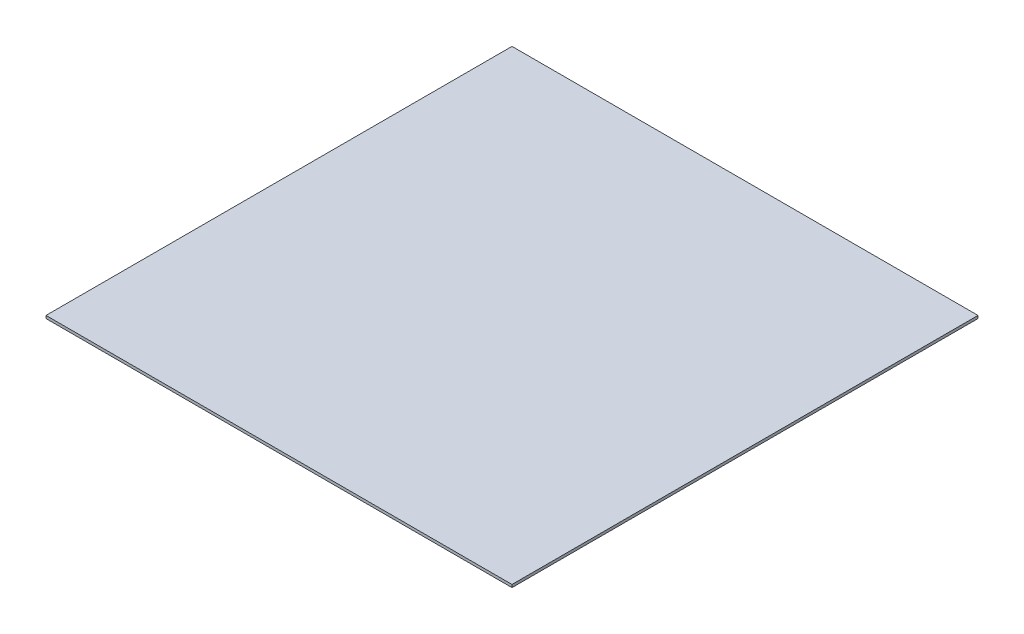
ISO-10303-21;
HEADER;
FILE_DESCRIPTION(('STEP AP214'),'2;1');
FILE_NAME('part.step','',(''),(''),'','','');
FILE_SCHEMA(('AUTOMOTIVE_DESIGN { 1 0 10303 214 1 1 1 1 }'));
ENDSEC;
DATA;
#1=APPLICATION_CONTEXT('core data for automotive mechanical design processes');
#2=APPLICATION_PROTOCOL_DEFINITION('international standard','automotive_design',2000,#1);
#3=PRODUCT_CONTEXT('',#1,'mechanical');
#4=PRODUCT('Part','Part','',(#3));
#5=PRODUCT_RELATED_PRODUCT_CATEGORY('part','',(#4));
#6=PRODUCT_DEFINITION_FORMATION('','',#4);
#7=PRODUCT_DEFINITION_CONTEXT('part definition',#1,'design');
#8=PRODUCT_DEFINITION('design','',#6,#7);
#9=PRODUCT_DEFINITION_SHAPE('','',#8);
#10=(LENGTH_UNIT() NAMED_UNIT(*) SI_UNIT(.MILLI.,.METRE.));
#11=(NAMED_UNIT(*) PLANE_ANGLE_UNIT() SI_UNIT($,.RADIAN.));
#12=(NAMED_UNIT(*) SI_UNIT($,.STERADIAN.) SOLID_ANGLE_UNIT());
#13=UNCERTAINTY_MEASURE_WITH_UNIT(LENGTH_MEASURE(1.E-05),#10,'distance_accuracy_value','');
#14=(GEOMETRIC_REPRESENTATION_CONTEXT(3) GLOBAL_UNCERTAINTY_ASSIGNED_CONTEXT((#13)) GLOBAL_UNIT_ASSIGNED_CONTEXT((#10,
#11,#12)) REPRESENTATION_CONTEXT('',''));
#15=CARTESIAN_POINT('',(0.,0.,0.));
#16=DIRECTION('',(0.,0.,1.));
#17=DIRECTION('',(1.,0.,0.));
#18=AXIS2_PLACEMENT_3D('',#15,#16,#17);
#19=CARTESIAN_POINT('',(0.,1.5,0.));
#20=DIRECTION('',(1.,0.,0.));
#21=DIRECTION('',(0.,0.,-1.));
#22=AXIS2_PLACEMENT_3D('',#19,#20,#21);
#23=PLANE('',#22);
#24=DIRECTION('',(0.,0.,1.));
#25=VECTOR('',#24,1.);
#26=CARTESIAN_POINT('',(0.,0.,0.));
#27=LINE('',#26,#25);
#28=CARTESIAN_POINT('',(0.,0.,-254.));
#29=VERTEX_POINT('',#28);
#30=CARTESIAN_POINT('',(0.,0.,0.));
#31=VERTEX_POINT('',#30);
#32=EDGE_CURVE('E107',#29,#31,#27,.T.);
#33=ORIENTED_EDGE('',*,*,#32,.T.);
#34=DIRECTION('',(0.,-1.,0.));
#35=VECTOR('',#34,1.);
#36=CARTESIAN_POINT('',(0.,1.5,0.));
#37=LINE('',#36,#35);
#38=CARTESIAN_POINT('',(0.,1.5,0.));
#39=VERTEX_POINT('',#38);
#40=EDGE_CURVE('E11',#39,#31,#37,.T.);
#41=ORIENTED_EDGE('',*,*,#40,.F.);
#42=DIRECTION('',(0.,0.,1.));
#43=VECTOR('',#42,1.);
#44=CARTESIAN_POINT('',(0.,1.5,0.));
#45=LINE('',#44,#43);
#46=CARTESIAN_POINT('',(0.,1.5,-254.));
#47=VERTEX_POINT('',#46);
#48=EDGE_CURVE('E91',#47,#39,#45,.T.);
#49=ORIENTED_EDGE('',*,*,#48,.F.);
#50=DIRECTION('',(0.,-1.,0.));
#51=VECTOR('',#50,1.);
#52=CARTESIAN_POINT('',(0.,1.5,-254.));
#53=LINE('',#52,#51);
#54=EDGE_CURVE('E103',#47,#29,#53,.T.);
#55=ORIENTED_EDGE('',*,*,#54,.T.);
#56=EDGE_LOOP('',(#33,#41,#49,#55));
#57=FACE_BOUND('',#56,.T.);
#58=ADVANCED_FACE('F39',(#57),#23,.F.);
#59=CARTESIAN_POINT('',(0.,1.5,0.));
#60=DIRECTION('',(0.,0.,-1.));
#61=DIRECTION('',(-1.,0.,0.));
#62=AXIS2_PLACEMENT_3D('',#59,#60,#61);
#63=PLANE('',#62);
#64=DIRECTION('',(1.,0.,0.));
#65=VECTOR('',#64,1.);
#66=CARTESIAN_POINT('',(0.,0.,0.));
#67=LINE('',#66,#65);
#68=CARTESIAN_POINT('',(254.,0.,0.));
#69=VERTEX_POINT('',#68);
#70=EDGE_CURVE('E96',#31,#69,#67,.T.);
#71=ORIENTED_EDGE('',*,*,#70,.T.);
#72=DIRECTION('',(0.,-1.,0.));
#73=VECTOR('',#72,1.);
#74=CARTESIAN_POINT('',(254.,1.5,0.));
#75=LINE('',#74,#73);
#76=CARTESIAN_POINT('',(254.,1.5,0.));
#77=VERTEX_POINT('',#76);
#78=EDGE_CURVE('E48',#77,#69,#75,.T.);
#79=ORIENTED_EDGE('',*,*,#78,.F.);
#80=DIRECTION('',(1.,0.,0.));
#81=VECTOR('',#80,1.);
#82=CARTESIAN_POINT('',(0.,1.5,0.));
#83=LINE('',#82,#81);
#84=EDGE_CURVE('E86',#39,#77,#83,.T.);
#85=ORIENTED_EDGE('',*,*,#84,.F.);
#86=ORIENTED_EDGE('',*,*,#40,.T.);
#87=EDGE_LOOP('',(#71,#79,#85,#86));
#88=FACE_BOUND('',#87,.T.);
#89=ADVANCED_FACE('F95',(#88),#63,.F.);
#90=CARTESIAN_POINT('',(254.,1.5,0.));
#91=DIRECTION('',(-1.,0.,0.));
#92=DIRECTION('',(0.,0.,1.));
#93=AXIS2_PLACEMENT_3D('',#90,#91,#92);
#94=PLANE('',#93);
#95=DIRECTION('',(0.,0.,-1.));
#96=VECTOR('',#95,1.);
#97=CARTESIAN_POINT('',(254.,0.,0.));
#98=LINE('',#97,#96);
#99=CARTESIAN_POINT('',(254.,0.,-254.));
#100=VERTEX_POINT('',#99);
#101=EDGE_CURVE('E73',#69,#100,#98,.T.);
#102=ORIENTED_EDGE('',*,*,#101,.T.);
#103=DIRECTION('',(0.,-1.,0.));
#104=VECTOR('',#103,1.);
#105=CARTESIAN_POINT('',(254.,1.5,-254.));
#106=LINE('',#105,#104);
#107=CARTESIAN_POINT('',(254.,1.5,-254.));
#108=VERTEX_POINT('',#107);
#109=EDGE_CURVE('E98',#108,#100,#106,.T.);
#110=ORIENTED_EDGE('',*,*,#109,.F.);
#111=DIRECTION('',(0.,0.,-1.));
#112=VECTOR('',#111,1.);
#113=CARTESIAN_POINT('',(254.,1.5,0.));
#114=LINE('',#113,#112);
#115=EDGE_CURVE('E89',#77,#108,#114,.T.);
#116=ORIENTED_EDGE('',*,*,#115,.F.);
#117=ORIENTED_EDGE('',*,*,#78,.T.);
#118=EDGE_LOOP('',(#102,#110,#116,#117));
#119=FACE_BOUND('',#118,.T.);
#120=ADVANCED_FACE('F99',(#119),#94,.F.);
#121=CARTESIAN_POINT('',(0.,1.5,-254.));
#122=DIRECTION('',(0.,0.,1.));
#123=DIRECTION('',(1.,0.,0.));
#124=AXIS2_PLACEMENT_3D('',#121,#122,#123);
#125=PLANE('',#124);
#126=DIRECTION('',(-1.,0.,0.));
#127=VECTOR('',#126,1.);
#128=CARTESIAN_POINT('',(0.,0.,-254.));
#129=LINE('',#128,#127);
#130=EDGE_CURVE('E79',#100,#29,#129,.T.);
#131=ORIENTED_EDGE('',*,*,#130,.T.);
#132=ORIENTED_EDGE('',*,*,#54,.F.);
#133=DIRECTION('',(-1.,0.,0.));
#134=VECTOR('',#133,1.);
#135=CARTESIAN_POINT('',(0.,1.5,-254.));
#136=LINE('',#135,#134);
#137=EDGE_CURVE('E56',#108,#47,#136,.T.);
#138=ORIENTED_EDGE('',*,*,#137,.F.);
#139=ORIENTED_EDGE('',*,*,#109,.T.);
#140=EDGE_LOOP('',(#131,#132,#138,#139));
#141=FACE_BOUND('',#140,.T.);
#142=ADVANCED_FACE('F120',(#141),#125,.F.);
#143=CARTESIAN_POINT('',(0.,1.5,0.));
#144=DIRECTION('',(0.,-1.,0.));
#145=DIRECTION('',(0.,0.,-1.));
#146=AXIS2_PLACEMENT_3D('',#143,#144,#145);
#147=PLANE('',#146);
#148=ORIENTED_EDGE('',*,*,#48,.T.);
#149=ORIENTED_EDGE('',*,*,#84,.T.);
#150=ORIENTED_EDGE('',*,*,#115,.T.);
#151=ORIENTED_EDGE('',*,*,#137,.T.);
#152=EDGE_LOOP('',(#148,#149,#150,#151));
#153=FACE_BOUND('',#152,.T.);
#154=ADVANCED_FACE('F87',(#153),#147,.F.);
#155=CARTESIAN_POINT('',(0.,0.,0.));
#156=DIRECTION('',(0.,-1.,0.));
#157=DIRECTION('',(0.,0.,-1.));
#158=AXIS2_PLACEMENT_3D('',#155,#156,#157);
#159=PLANE('',#158);
#160=ORIENTED_EDGE('',*,*,#32,.F.);
#161=ORIENTED_EDGE('',*,*,#130,.F.);
#162=ORIENTED_EDGE('',*,*,#101,.F.);
#163=ORIENTED_EDGE('',*,*,#70,.F.);
#164=EDGE_LOOP('',(#160,#161,#162,#163));
#165=FACE_BOUND('',#164,.T.);
#166=ADVANCED_FACE('F123',(#165),#159,.T.);
#167=CLOSED_SHELL('',(#58,#89,#120,#142,#154,#166));
#168=MANIFOLD_SOLID_BREP('B2',#167);
#169=ADVANCED_BREP_SHAPE_REPRESENTATION('',(#18,#168),#14);
#170=SHAPE_DEFINITION_REPRESENTATION(#9,#169);
ENDSEC;
END-ISO-10303-21;
